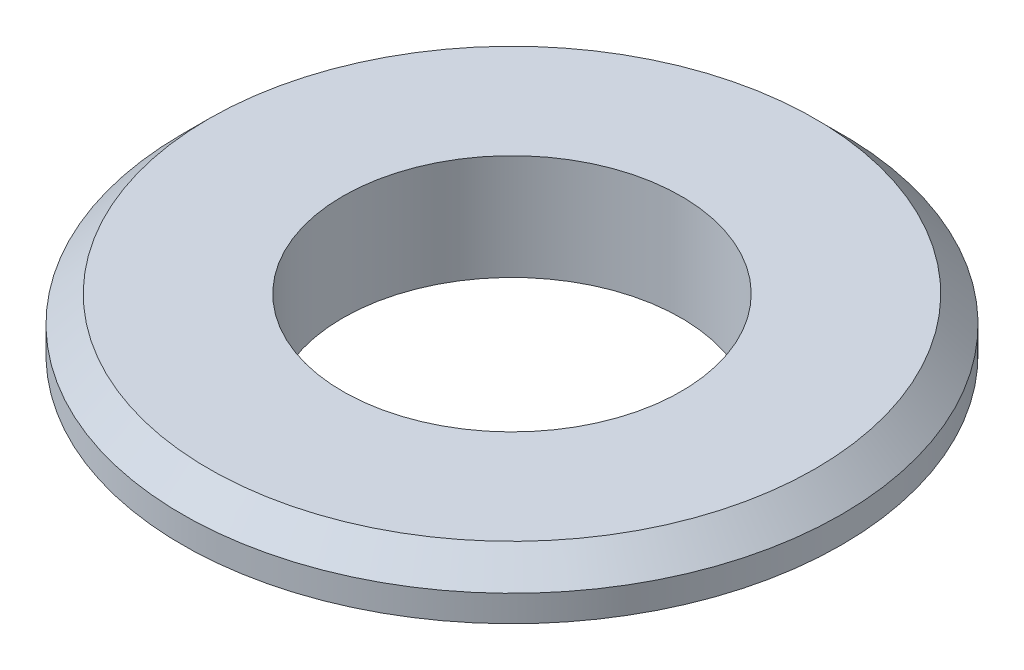
ISO-10303-21;
HEADER;
FILE_DESCRIPTION(('STEP AP214'),'2;1');
FILE_NAME('part.step','',(''),(''),'','','');
FILE_SCHEMA(('AUTOMOTIVE_DESIGN { 1 0 10303 214 1 1 1 1 }'));
ENDSEC;
DATA;
#1=APPLICATION_CONTEXT('core data for automotive mechanical design processes');
#2=APPLICATION_PROTOCOL_DEFINITION('international standard','automotive_design',2000,#1);
#3=PRODUCT_CONTEXT('',#1,'mechanical');
#4=PRODUCT('Part','Part','',(#3));
#5=PRODUCT_RELATED_PRODUCT_CATEGORY('part','',(#4));
#6=PRODUCT_DEFINITION_FORMATION('','',#4);
#7=PRODUCT_DEFINITION_CONTEXT('part definition',#1,'design');
#8=PRODUCT_DEFINITION('design','',#6,#7);
#9=PRODUCT_DEFINITION_SHAPE('','',#8);
#10=(LENGTH_UNIT() NAMED_UNIT(*) SI_UNIT(.MILLI.,.METRE.));
#11=(NAMED_UNIT(*) PLANE_ANGLE_UNIT() SI_UNIT($,.RADIAN.));
#12=(NAMED_UNIT(*) SI_UNIT($,.STERADIAN.) SOLID_ANGLE_UNIT());
#13=UNCERTAINTY_MEASURE_WITH_UNIT(LENGTH_MEASURE(1.E-05),#10,'distance_accuracy_value','');
#14=(GEOMETRIC_REPRESENTATION_CONTEXT(3) GLOBAL_UNCERTAINTY_ASSIGNED_CONTEXT((#13)) GLOBAL_UNIT_ASSIGNED_CONTEXT((#10,
#11,#12)) REPRESENTATION_CONTEXT('',''));
#15=CARTESIAN_POINT('',(0.,0.,0.));
#16=DIRECTION('',(0.,0.,1.));
#17=DIRECTION('',(1.,0.,0.));
#18=AXIS2_PLACEMENT_3D('',#15,#16,#17);
#19=CARTESIAN_POINT('',(-8.76299999999999,0.,0.));
#20=DIRECTION('',(0.,1.,0.));
#21=DIRECTION('',(-1.,0.,0.));
#22=AXIS2_PLACEMENT_3D('',#19,#20,#21);
#23=PLANE('',#22);
#24=CARTESIAN_POINT('',(0.,0.,0.));
#25=DIRECTION('',(0.,1.,0.));
#26=DIRECTION('',(-1.,0.,0.));
#27=AXIS2_PLACEMENT_3D('',#24,#25,#26);
#28=CIRCLE('',#27,8.76299999999999);
#29=CARTESIAN_POINT('',(-8.76299999999999,0.,0.));
#30=VERTEX_POINT('',#29);
#31=EDGE_CURVE('E59',#30,#30,#28,.T.);
#32=ORIENTED_EDGE('',*,*,#31,.T.);
#33=EDGE_LOOP('',(#32));
#34=FACE_BOUND('',#33,.T.);
#35=CARTESIAN_POINT('',(0.,0.,0.));
#36=DIRECTION('',(0.,1.,0.));
#37=DIRECTION('',(-1.,0.,0.));
#38=AXIS2_PLACEMENT_3D('',#35,#36,#37);
#39=CIRCLE('',#38,4.8895);
#40=CARTESIAN_POINT('',(-4.8895,0.,0.));
#41=VERTEX_POINT('',#40);
#42=EDGE_CURVE('E10',#41,#41,#39,.T.);
#43=ORIENTED_EDGE('',*,*,#42,.F.);
#44=EDGE_LOOP('',(#43));
#45=FACE_BOUND('',#44,.T.);
#46=ADVANCED_FACE('F34',(#34,#45),#23,.T.);
#47=CARTESIAN_POINT('',(0.,0.,0.));
#48=DIRECTION('',(0.,1.,0.));
#49=DIRECTION('',(-1.,0.,0.));
#50=AXIS2_PLACEMENT_3D('',#47,#48,#49);
#51=CYLINDRICAL_SURFACE('',#50,4.8895);
#52=ORIENTED_EDGE('',*,*,#42,.T.);
#53=EDGE_LOOP('',(#52));
#54=FACE_BOUND('',#53,.T.);
#55=CARTESIAN_POINT('',(0.,-3.048,0.));
#56=DIRECTION('',(0.,1.,0.));
#57=DIRECTION('',(-1.,0.,0.));
#58=AXIS2_PLACEMENT_3D('',#55,#56,#57);
#59=CIRCLE('',#58,4.8895);
#60=CARTESIAN_POINT('',(-4.8895,-3.048,0.));
#61=VERTEX_POINT('',#60);
#62=EDGE_CURVE('E40',#61,#61,#59,.T.);
#63=ORIENTED_EDGE('',*,*,#62,.F.);
#64=EDGE_LOOP('',(#63));
#65=FACE_BOUND('',#64,.T.);
#66=ADVANCED_FACE('F77',(#54,#65),#51,.F.);
#67=CARTESIAN_POINT('',(-4.8895,-3.048,0.));
#68=DIRECTION('',(0.,-1.,0.));
#69=DIRECTION('',(1.,0.,0.));
#70=AXIS2_PLACEMENT_3D('',#67,#68,#69);
#71=PLANE('',#70);
#72=ORIENTED_EDGE('',*,*,#62,.T.);
#73=EDGE_LOOP('',(#72));
#74=FACE_BOUND('',#73,.T.);
#75=CARTESIAN_POINT('',(0.,-3.048,0.));
#76=DIRECTION('',(0.,1.,0.));
#77=DIRECTION('',(-1.,0.,0.));
#78=AXIS2_PLACEMENT_3D('',#75,#76,#77);
#79=CIRCLE('',#78,6.35);
#80=CARTESIAN_POINT('',(-6.35,-3.048,0.));
#81=VERTEX_POINT('',#80);
#82=EDGE_CURVE('E44',#81,#81,#79,.T.);
#83=ORIENTED_EDGE('',*,*,#82,.F.);
#84=EDGE_LOOP('',(#83));
#85=FACE_BOUND('',#84,.T.);
#86=ADVANCED_FACE('F81',(#74,#85),#71,.T.);
#87=CARTESIAN_POINT('',(0.,0.,0.));
#88=DIRECTION('',(0.,1.,0.));
#89=DIRECTION('',(-1.,0.,0.));
#90=AXIS2_PLACEMENT_3D('',#87,#88,#89);
#91=CYLINDRICAL_SURFACE('',#90,6.35);
#92=ORIENTED_EDGE('',*,*,#82,.T.);
#93=EDGE_LOOP('',(#92));
#94=FACE_BOUND('',#93,.T.);
#95=CARTESIAN_POINT('',(0.,-1.524,0.));
#96=DIRECTION('',(0.,1.,0.));
#97=DIRECTION('',(-1.,0.,0.));
#98=AXIS2_PLACEMENT_3D('',#95,#96,#97);
#99=CIRCLE('',#98,6.35);
#100=CARTESIAN_POINT('',(-6.35,-1.524,0.));
#101=VERTEX_POINT('',#100);
#102=EDGE_CURVE('E48',#101,#101,#99,.T.);
#103=ORIENTED_EDGE('',*,*,#102,.F.);
#104=EDGE_LOOP('',(#103));
#105=FACE_BOUND('',#104,.T.);
#106=ADVANCED_FACE('F85',(#94,#105),#91,.T.);
#107=CARTESIAN_POINT('',(-6.35,-1.524,0.));
#108=DIRECTION('',(0.,-1.,0.));
#109=DIRECTION('',(1.,0.,0.));
#110=AXIS2_PLACEMENT_3D('',#107,#108,#109);
#111=PLANE('',#110);
#112=ORIENTED_EDGE('',*,*,#102,.T.);
#113=EDGE_LOOP('',(#112));
#114=FACE_BOUND('',#113,.T.);
#115=CARTESIAN_POINT('',(0.,-1.524,0.));
#116=DIRECTION('',(0.,1.,0.));
#117=DIRECTION('',(-1.,0.,0.));
#118=AXIS2_PLACEMENT_3D('',#115,#116,#117);
#119=CIRCLE('',#118,9.525);
#120=CARTESIAN_POINT('',(-9.525,-1.524,0.));
#121=VERTEX_POINT('',#120);
#122=EDGE_CURVE('E53',#121,#121,#119,.T.);
#123=ORIENTED_EDGE('',*,*,#122,.F.);
#124=EDGE_LOOP('',(#123));
#125=FACE_BOUND('',#124,.T.);
#126=ADVANCED_FACE('F73',(#114,#125),#111,.T.);
#127=CARTESIAN_POINT('',(0.,0.,0.));
#128=DIRECTION('',(0.,1.,0.));
#129=DIRECTION('',(-1.,0.,0.));
#130=AXIS2_PLACEMENT_3D('',#127,#128,#129);
#131=CYLINDRICAL_SURFACE('',#130,9.525);
#132=ORIENTED_EDGE('',*,*,#122,.T.);
#133=EDGE_LOOP('',(#132));
#134=FACE_BOUND('',#133,.T.);
#135=CARTESIAN_POINT('',(0.,-0.762,0.));
#136=DIRECTION('',(0.,1.,0.));
#137=DIRECTION('',(-1.,0.,0.));
#138=AXIS2_PLACEMENT_3D('',#135,#136,#137);
#139=CIRCLE('',#138,9.525);
#140=CARTESIAN_POINT('',(-9.525,-0.762000000000001,0.));
#141=VERTEX_POINT('',#140);
#142=EDGE_CURVE('E56',#141,#141,#139,.T.);
#143=ORIENTED_EDGE('',*,*,#142,.F.);
#144=EDGE_LOOP('',(#143));
#145=FACE_BOUND('',#144,.T.);
#146=ADVANCED_FACE('F67',(#134,#145),#131,.T.);
#147=CARTESIAN_POINT('',(0.,0.,0.));
#148=DIRECTION('',(0.,-1.,0.));
#149=DIRECTION('',(1.,0.,0.));
#150=AXIS2_PLACEMENT_3D('',#147,#148,#149);
#151=CONICAL_SURFACE('',#150,8.76299999999999,0.78539816339745);
#152=ORIENTED_EDGE('',*,*,#142,.T.);
#153=EDGE_LOOP('',(#152));
#154=FACE_BOUND('',#153,.T.);
#155=ORIENTED_EDGE('',*,*,#31,.F.);
#156=EDGE_LOOP('',(#155));
#157=FACE_BOUND('',#156,.T.);
#158=ADVANCED_FACE('F65',(#154,#157),#151,.T.);
#159=CLOSED_SHELL('',(#46,#66,#86,#106,#126,#146,#158));
#160=MANIFOLD_SOLID_BREP('B2',#159);
#161=ADVANCED_BREP_SHAPE_REPRESENTATION('',(#18,#160),#14);
#162=SHAPE_DEFINITION_REPRESENTATION(#9,#161);
ENDSEC;
END-ISO-10303-21;
